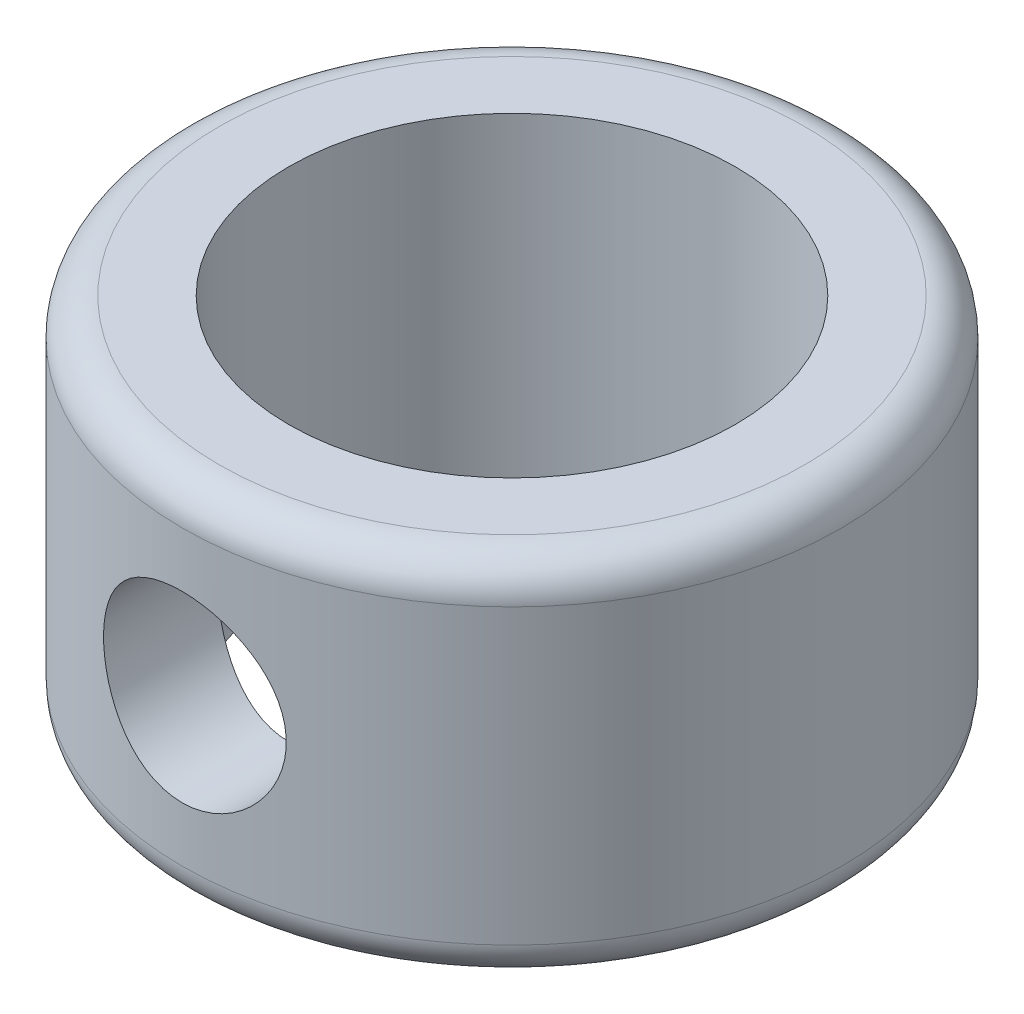
ISO-10303-21;
HEADER;
FILE_DESCRIPTION(('STEP AP214'),'2;1');
FILE_NAME('part.step','',(''),(''),'','','');
FILE_SCHEMA(('AUTOMOTIVE_DESIGN { 1 0 10303 214 1 1 1 1 }'));
ENDSEC;
DATA;
#1=APPLICATION_CONTEXT('core data for automotive mechanical design processes');
#2=APPLICATION_PROTOCOL_DEFINITION('international standard','automotive_design',2000,#1);
#3=PRODUCT_CONTEXT('',#1,'mechanical');
#4=PRODUCT('Part','Part','',(#3));
#5=PRODUCT_RELATED_PRODUCT_CATEGORY('part','',(#4));
#6=PRODUCT_DEFINITION_FORMATION('','',#4);
#7=PRODUCT_DEFINITION_CONTEXT('part definition',#1,'design');
#8=PRODUCT_DEFINITION('design','',#6,#7);
#9=PRODUCT_DEFINITION_SHAPE('','',#8);
#10=(LENGTH_UNIT() NAMED_UNIT(*) SI_UNIT(.MILLI.,.METRE.));
#11=(NAMED_UNIT(*) PLANE_ANGLE_UNIT() SI_UNIT($,.RADIAN.));
#12=(NAMED_UNIT(*) SI_UNIT($,.STERADIAN.) SOLID_ANGLE_UNIT());
#13=UNCERTAINTY_MEASURE_WITH_UNIT(LENGTH_MEASURE(1.E-05),#10,'distance_accuracy_value','');
#14=(GEOMETRIC_REPRESENTATION_CONTEXT(3) GLOBAL_UNCERTAINTY_ASSIGNED_CONTEXT((#13)) GLOBAL_UNIT_ASSIGNED_CONTEXT((#10,
#11,#12)) REPRESENTATION_CONTEXT('',''));
#15=CARTESIAN_POINT('',(0.,0.,0.));
#16=DIRECTION('',(0.,0.,1.));
#17=DIRECTION('',(1.,0.,0.));
#18=AXIS2_PLACEMENT_3D('',#15,#16,#17);
#19=CARTESIAN_POINT('',(0.,5.,0.));
#20=DIRECTION('',(0.,-1.,0.));
#21=DIRECTION('',(0.,0.,-1.));
#22=AXIS2_PLACEMENT_3D('',#19,#20,#21);
#23=CYLINDRICAL_SURFACE('',#22,4.5);
#24=CARTESIAN_POINT('',(0.,0.5,0.));
#25=DIRECTION('',(0.,1.,0.));
#26=DIRECTION('',(0.,0.,1.));
#27=AXIS2_PLACEMENT_3D('',#24,#25,#26);
#28=CIRCLE('',#27,4.5);
#29=CARTESIAN_POINT('',(0.,0.5,4.5));
#30=VERTEX_POINT('',#29);
#31=EDGE_CURVE('E45',#30,#30,#28,.T.);
#32=ORIENTED_EDGE('',*,*,#31,.T.);
#33=EDGE_LOOP('',(#32));
#34=FACE_BOUND('',#33,.T.);
#35=CARTESIAN_POINT('',(0.,4.5,0.));
#36=DIRECTION('',(0.,1.,0.));
#37=DIRECTION('',(0.,0.,1.));
#38=AXIS2_PLACEMENT_3D('',#35,#36,#37);
#39=CIRCLE('',#38,4.5);
#40=CARTESIAN_POINT('',(0.,4.5,4.5));
#41=VERTEX_POINT('',#40);
#42=EDGE_CURVE('E49',#41,#41,#39,.F.);
#43=ORIENTED_EDGE('',*,*,#42,.T.);
#44=EDGE_LOOP('',(#43));
#45=FACE_BOUND('',#44,.T.);
#46=CARTESIAN_POINT('',(0.,1.25002036742956,4.5));
#47=CARTESIAN_POINT('',(-0.0687867985193077,1.24962908340539,4.49999907835162));
#48=CARTESIAN_POINT('',(-0.137620681646486,1.25493193469285,4.49840740364831));
#49=CARTESIAN_POINT('',(-0.273363478537243,1.27674495379179,4.4922039229699));
#50=CARTESIAN_POINT('',(-0.340271575717872,1.29325980487634,4.48759085498165));
#51=CARTESIAN_POINT('',(-0.470182706848189,1.3369104939956,4.47584396965219));
#52=CARTESIAN_POINT('',(-0.533190863191631,1.36403204234445,4.46871354502711));
#53=CARTESIAN_POINT('',(-0.653761083188665,1.42806843134332,4.45267340309822));
#54=CARTESIAN_POINT('',(-0.711322657732572,1.46498415039163,4.44376352622049));
#55=CARTESIAN_POINT('',(-0.820805482224509,1.54853322226079,4.42486573902697));
#56=CARTESIAN_POINT('',(-0.872570854926272,1.5953663662246,4.4148580976246));
#57=CARTESIAN_POINT('',(-0.967624900953231,1.69700363330436,4.39500453366049));
#58=CARTESIAN_POINT('',(-1.01091234602417,1.75180890939515,4.38515863472049));
#59=CARTESIAN_POINT('',(-1.08859818040814,1.86914086806043,4.36653013557554));
#60=CARTESIAN_POINT('',(-1.12280796048446,1.93179665051689,4.35777185117617));
#61=CARTESIAN_POINT('',(-1.18014531755461,2.06225343690932,4.34259631371382));
#62=CARTESIAN_POINT('',(-1.20327510888978,2.13005340963617,4.33617859294927));
#63=CARTESIAN_POINT('',(-1.23723553631823,2.26714805037647,4.3266100935685));
#64=CARTESIAN_POINT('',(-1.24834958344264,2.33636713180389,4.32338419398391));
#65=CARTESIAN_POINT('',(-1.25885235075043,2.47575707450915,4.32033829650219));
#66=CARTESIAN_POINT('',(-1.25824354773085,2.54592773160789,4.32051757916001));
#67=CARTESIAN_POINT('',(-1.24553385619361,2.68290505674429,4.32419751120066));
#68=CARTESIAN_POINT('',(-1.23379246765751,2.74974834307287,4.32759425702248));
#69=CARTESIAN_POINT('',(-1.19973901545681,2.88047432617669,4.3371575877039));
#70=CARTESIAN_POINT('',(-1.17742607934798,2.94435677812364,4.34332440116831));
#71=CARTESIAN_POINT('',(-1.12261291302239,3.06819795538592,4.35781464118756));
#72=CARTESIAN_POINT('',(-1.08999956380315,3.12810371272757,4.36616182745472));
#73=CARTESIAN_POINT('',(-1.0155883454909,3.24171205091617,4.38406671560457));
#74=CARTESIAN_POINT('',(-0.973788519105874,3.29541330609178,4.39362467527333));
#75=CARTESIAN_POINT('',(-0.880408554083317,3.39712307008418,4.4133019002558));
#76=CARTESIAN_POINT('',(-0.828530302691036,3.44485676908894,4.42342898181173));
#77=CARTESIAN_POINT('',(-0.717390722758334,3.5310099777,4.44280630624069));
#78=CARTESIAN_POINT('',(-0.658128988504778,3.5694289751331,4.45205650088066));
#79=CARTESIAN_POINT('',(-0.533381866306301,3.63604317806341,4.46872272334313));
#80=CARTESIAN_POINT('',(-0.467860175832484,3.66417353112155,4.47612702592078));
#81=CARTESIAN_POINT('',(-0.332763217120183,3.70893635514701,4.48819125195288));
#82=CARTESIAN_POINT('',(-0.263188910739072,3.72557154244453,4.49285182371774));
#83=CARTESIAN_POINT('',(-0.124267746124466,3.74641906822345,4.49880442318295));
#84=CARTESIAN_POINT('',(-0.0549803351293656,3.7509995155806,4.5001961230763));
#85=CARTESIAN_POINT('',(0.083382074011731,3.74863625871982,4.4997590624576));
#86=CARTESIAN_POINT('',(0.152457096564681,3.74169393234098,4.49793068698543));
#87=CARTESIAN_POINT('',(0.287008968063931,3.71678611245671,4.49133353286731));
#88=CARTESIAN_POINT('',(0.352530032201255,3.69904227731882,4.48662387179653));
#89=CARTESIAN_POINT('',(0.479656418485948,3.65329892252477,4.47481941110882));
#90=CARTESIAN_POINT('',(0.541261317673154,3.6252982972987,4.46772435437908));
#91=CARTESIAN_POINT('',(0.660166857617373,3.55920996989491,4.45172472445217));
#92=CARTESIAN_POINT('',(0.71735769153401,3.52093294768485,4.44278700678431));
#93=CARTESIAN_POINT('',(0.82463354567207,3.43560650478259,4.42413258386829));
#94=CARTESIAN_POINT('',(0.874717040343792,3.38855520574228,4.41441571207753));
#95=CARTESIAN_POINT('',(0.967964107885223,3.28528221224737,4.39492754084472));
#96=CARTESIAN_POINT('',(1.01086495402419,3.22882140261351,4.38516389637364));
#97=CARTESIAN_POINT('',(1.08659855743341,3.1093025440408,4.36701565043549));
#98=CARTESIAN_POINT('',(1.11943160562284,3.04624468580095,4.35863100912397));
#99=CARTESIAN_POINT('',(1.17389115677597,2.91552936891266,4.34428061155656));
#100=CARTESIAN_POINT('',(1.19556746346289,2.84789390392364,4.33830413170084));
#101=CARTESIAN_POINT('',(1.22717637262954,2.70974108303954,4.32947022662521));
#102=CARTESIAN_POINT('',(1.23711226305489,2.63922453972692,4.32661192816466));
#103=CARTESIAN_POINT('',(1.24473935729844,2.49997329205795,4.32442342261644));
#104=CARTESIAN_POINT('',(1.24284881626762,2.43126311671963,4.32497269702351));
#105=CARTESIAN_POINT('',(1.2278681394314,2.29518083655786,4.32924926371648));
#106=CARTESIAN_POINT('',(1.21477839632322,2.22780868490171,4.33297644456987));
#107=CARTESIAN_POINT('',(1.17803526422238,2.09695656574252,4.34310809357223));
#108=CARTESIAN_POINT('',(1.15448728923489,2.03344477501691,4.34948580541169));
#109=CARTESIAN_POINT('',(1.09757830879849,1.91122748101352,4.36419312744464));
#110=CARTESIAN_POINT('',(1.06421567966895,1.85252277504838,4.37252306055612));
#111=CARTESIAN_POINT('',(0.987411180656536,1.73961759171712,4.39051456363658));
#112=CARTESIAN_POINT('',(0.943688947121821,1.6856131288158,4.40020940609471));
#113=CARTESIAN_POINT('',(0.847916655700465,1.58556985387657,4.41966300578545));
#114=CARTESIAN_POINT('',(0.795864530532489,1.53953302513521,4.42942177830587));
#115=CARTESIAN_POINT('',(0.683403674093089,1.45563725480219,4.44817740124969));
#116=CARTESIAN_POINT('',(0.622824309691489,1.41800120010594,4.45715033259884));
#117=CARTESIAN_POINT('',(0.495952725011888,1.35350126375061,4.47304216048424));
#118=CARTESIAN_POINT('',(0.429663858590424,1.32663110975153,4.47996225241686));
#119=CARTESIAN_POINT('',(0.303127065866537,1.28757704232177,4.49016109581678));
#120=CARTESIAN_POINT('',(0.243386651128978,1.27383398021878,4.49382106340418));
#121=CARTESIAN_POINT('',(0.122443147581194,1.25523034986168,4.49874078285427));
#122=CARTESIAN_POINT('',(0.061240233825373,1.25036872388236,4.50000082053481));
#123=CARTESIAN_POINT('',(0.,1.25002036742956,4.5));
#124=B_SPLINE_CURVE_WITH_KNOTS('',3,(#46,#47,#48,#49,#50,#51,#52,#53,#54,#55,#56,#57,#58,#59,
#60,#61,#62,#63,#64,#65,#66,#67,#68,#69,#70,#71,#72,#73,#74,#75,#76,#77,#78,#79,#80,#81,#82,#83,
#84,#85,#86,#87,#88,#89,#90,#91,#92,#93,#94,#95,#96,#97,#98,#99,#100,#101,#102,#103,#104,#105,
#106,#107,#108,#109,#110,#111,#112,#113,#114,#115,#116,#117,#118,#119,#120,#121,#122,#123),
.UNSPECIFIED.,.T.,.F.,(4,2,2,2,2,2,2,2,2,2,2,2,2,2,2,2,2,2,2,2,2,2,2,2,2,2,2,2,2,2,2,2,2,2,2,2,
2,2,4),(0.,0.206139121204505,0.412364400121111,0.618312797506904,0.824279671792413,
1.03487653083714,1.24550387792887,1.46021480243648,1.67488279893733,1.88436893904116,
2.0938108195196,2.29671167788631,2.49962928408743,2.7048577114755,2.91012990777037,
3.12279778847776,3.33547736017691,3.54947530874809,3.76342267187625,3.97075669022877,
4.17806591834052,4.381257983736,4.58447195746386,4.79172254594927,4.99901755251914,
5.21274033603257,5.4264569432284,5.63921105906272,5.85190557821312,6.05712148226377,
6.26233019076476,6.46551584713078,6.66873513629894,6.8782534287847,7.08782379960554,
7.30242588461178,7.51690275748173,7.7004483210906,7.88397202411012),.UNSPECIFIED.);
#125=CARTESIAN_POINT('',(0.,1.25002036742956,4.5));
#126=VERTEX_POINT('',#125);
#127=EDGE_CURVE('E54',#126,#126,#124,.T.);
#128=ORIENTED_EDGE('',*,*,#127,.T.);
#129=EDGE_LOOP('',(#128));
#130=FACE_BOUND('',#129,.T.);
#131=ADVANCED_FACE('F34',(#34,#45,#130),#23,.T.);
#132=CARTESIAN_POINT('',(0.,5.,0.));
#133=DIRECTION('',(0.,1.,0.));
#134=DIRECTION('',(0.,0.,1.));
#135=AXIS2_PLACEMENT_3D('',#132,#133,#134);
#136=PLANE('',#135);
#137=CARTESIAN_POINT('',(0.,5.,0.));
#138=DIRECTION('',(0.,1.,0.));
#139=DIRECTION('',(0.,0.,1.));
#140=AXIS2_PLACEMENT_3D('',#137,#138,#139);
#141=CIRCLE('',#140,4.);
#142=CARTESIAN_POINT('',(0.,5.,4.));
#143=VERTEX_POINT('',#142);
#144=EDGE_CURVE('E10',#143,#143,#141,.T.);
#145=ORIENTED_EDGE('',*,*,#144,.T.);
#146=EDGE_LOOP('',(#145));
#147=FACE_BOUND('',#146,.T.);
#148=CARTESIAN_POINT('',(0.,5.,0.));
#149=DIRECTION('',(0.,1.,0.));
#150=DIRECTION('',(0.,0.,1.));
#151=AXIS2_PLACEMENT_3D('',#148,#149,#150);
#152=CIRCLE('',#151,3.05);
#153=CARTESIAN_POINT('',(0.,5.,3.05));
#154=VERTEX_POINT('',#153);
#155=EDGE_CURVE('E82',#154,#154,#152,.T.);
#156=ORIENTED_EDGE('',*,*,#155,.F.);
#157=EDGE_LOOP('',(#156));
#158=FACE_BOUND('',#157,.T.);
#159=ADVANCED_FACE('F96',(#147,#158),#136,.T.);
#160=CARTESIAN_POINT('',(0.,0.,0.));
#161=DIRECTION('',(0.,1.,0.));
#162=DIRECTION('',(0.,0.,1.));
#163=AXIS2_PLACEMENT_3D('',#160,#161,#162);
#164=PLANE('',#163);
#165=CARTESIAN_POINT('',(0.,0.,0.));
#166=DIRECTION('',(0.,1.,0.));
#167=DIRECTION('',(0.,0.,1.));
#168=AXIS2_PLACEMENT_3D('',#165,#166,#167);
#169=CIRCLE('',#168,4.);
#170=CARTESIAN_POINT('',(0.,0.,4.));
#171=VERTEX_POINT('',#170);
#172=EDGE_CURVE('E41',#171,#171,#169,.F.);
#173=ORIENTED_EDGE('',*,*,#172,.T.);
#174=EDGE_LOOP('',(#173));
#175=FACE_BOUND('',#174,.T.);
#176=CARTESIAN_POINT('',(0.,0.,0.));
#177=DIRECTION('',(0.,1.,0.));
#178=DIRECTION('',(0.,0.,1.));
#179=AXIS2_PLACEMENT_3D('',#176,#177,#178);
#180=CIRCLE('',#179,3.05);
#181=CARTESIAN_POINT('',(0.,0.,3.05));
#182=VERTEX_POINT('',#181);
#183=EDGE_CURVE('E62',#182,#182,#180,.T.);
#184=ORIENTED_EDGE('',*,*,#183,.T.);
#185=EDGE_LOOP('',(#184));
#186=FACE_BOUND('',#185,.T.);
#187=ADVANCED_FACE('F89',(#175,#186),#164,.F.);
#188=CARTESIAN_POINT('',(0.,5.,0.));
#189=DIRECTION('',(0.,1.,0.));
#190=DIRECTION('',(0.,0.,1.));
#191=AXIS2_PLACEMENT_3D('',#188,#189,#190);
#192=CYLINDRICAL_SURFACE('',#191,3.05);
#193=CARTESIAN_POINT('',(0.,1.25002036742956,3.05));
#194=CARTESIAN_POINT('',(0.0670769721493477,1.25041010025507,3.04999491013113));
#195=CARTESIAN_POINT('',(0.134233415638585,1.25621826325433,3.04776143142519));
#196=CARTESIAN_POINT('',(0.266585171113359,1.27848248298864,3.03905584781216));
#197=CARTESIAN_POINT('',(0.331774774912775,1.29496689713114,3.03257245406189));
#198=CARTESIAN_POINT('',(0.458065048408787,1.33788181508863,3.01607641220413));
#199=CARTESIAN_POINT('',(0.519178631054849,1.36427896147729,3.00607560764593));
#200=CARTESIAN_POINT('',(0.636060061060386,1.42614049908713,2.98353402578099));
#201=CARTESIAN_POINT('',(0.69182962106131,1.46160197193953,2.97099406625526));
#202=CARTESIAN_POINT('',(0.799255158881872,1.54242422806007,2.9439592003857));
#203=CARTESIAN_POINT('',(0.850615602115044,1.58815682153028,2.929401943291));
#204=CARTESIAN_POINT('',(0.945187330370352,1.68742126316986,2.90027144657979));
#205=CARTESIAN_POINT('',(0.988394519352787,1.74095700768392,2.88569820260984));
#206=CARTESIAN_POINT('',(1.06739037263102,1.85730237406444,2.85745009411059));
#207=CARTESIAN_POINT('',(1.10274573873528,1.92042554894618,2.84384751381296));
#208=CARTESIAN_POINT('',(1.16220204415617,2.05236465834953,2.82007440789626));
#209=CARTESIAN_POINT('',(1.18630870447468,2.12117767805133,2.80990213838017));
#210=CARTESIAN_POINT('',(1.22139487465613,2.25910505631156,2.7948247897682));
#211=CARTESIAN_POINT('',(1.23294639032003,2.32804803329747,2.78969133658815));
#212=CARTESIAN_POINT('',(1.24437275605795,2.46707006563922,2.78461488413713));
#213=CARTESIAN_POINT('',(1.24425348579299,2.53714853115154,2.78466927126784));
#214=CARTESIAN_POINT('',(1.23279352224004,2.67107493034962,2.78975800005259));
#215=CARTESIAN_POINT('',(1.22226122980348,2.73500823047868,2.79443357400452));
#216=CARTESIAN_POINT('',(1.19160153671014,2.86010899142539,2.80764341171868));
#217=CARTESIAN_POINT('',(1.1714723337743,2.92127593036309,2.81617840025511));
#218=CARTESIAN_POINT('',(1.1217525815707,3.04073393601966,2.83635374439702));
#219=CARTESIAN_POINT('',(1.09195803496015,3.09892846798015,2.84806006574263));
#220=CARTESIAN_POINT('',(1.02389858511202,3.20971764685711,2.87322919118899));
#221=CARTESIAN_POINT('',(0.985630389530832,3.26231010535358,2.88669267717973));
#222=CARTESIAN_POINT('',(0.898090030748225,3.36485123925447,2.91516990374001));
#223=CARTESIAN_POINT('',(0.84818020701295,3.41424667088679,2.93022121487356));
#224=CARTESIAN_POINT('',(0.740606266504248,3.50413949442877,2.95924035140579));
#225=CARTESIAN_POINT('',(0.682940609294794,3.54463511447006,2.97320796069221));
#226=CARTESIAN_POINT('',(0.560017151797231,3.61623890392525,2.99881491093991));
#227=CARTESIAN_POINT('',(0.494635866268884,3.64715398800045,3.01040494505797));
#228=CARTESIAN_POINT('',(0.359004746658766,3.69735635718213,3.02957003150459));
#229=CARTESIAN_POINT('',(0.288757562334106,3.71664991621883,3.03714724990156));
#230=CARTESIAN_POINT('',(0.150096459366589,3.7419467819529,3.04704758653491));
#231=CARTESIAN_POINT('',(0.0818411278799048,3.74870342326728,3.04966871918241));
#232=CARTESIAN_POINT('',(-0.054866960224199,3.75095631464284,3.05027164089632));
#233=CARTESIAN_POINT('',(-0.123319660994059,3.74645548725879,3.04825463408243));
#234=CARTESIAN_POINT('',(-0.2551937512099,3.72686962648057,3.03999112988154));
#235=CARTESIAN_POINT('',(-0.318702082076101,3.71227793078707,3.03394222887373));
#236=CARTESIAN_POINT('',(-0.442302683123258,3.67359492211695,3.01840208953266));
#237=CARTESIAN_POINT('',(-0.502394491596296,3.64950232866642,3.00891038721317));
#238=CARTESIAN_POINT('',(-0.619683569519472,3.59165116387092,2.98700028176777));
#239=CARTESIAN_POINT('',(-0.676719780658615,3.55759973610966,2.97449560094503));
#240=CARTESIAN_POINT('',(-0.784473703099655,3.48112939356379,2.94791215327982));
#241=CARTESIAN_POINT('',(-0.835188747012935,3.43870696578164,2.93383272665334));
#242=CARTESIAN_POINT('',(-0.932552235203891,3.3432484620723,2.90441218068575));
#243=CARTESIAN_POINT('',(-0.978674373776932,3.28968019649481,2.88905130034701));
#244=CARTESIAN_POINT('',(-1.06140267024452,3.17528105257672,2.85969514199335));
#245=CARTESIAN_POINT('',(-1.09800710587583,3.11444886270449,2.84570011141976));
#246=CARTESIAN_POINT('',(-1.16089538834314,2.98629254535668,2.82063554299356));
#247=CARTESIAN_POINT('',(-1.18707275202098,2.91890976470165,2.80959654845095));
#248=CARTESIAN_POINT('',(-1.22748838041806,2.78009608482664,2.79217946650473));
#249=CARTESIAN_POINT('',(-1.24173625898667,2.70866849493922,2.78579762648194));
#250=CARTESIAN_POINT('',(-1.25699441697459,2.5697068226194,2.77894367185747));
#251=CARTESIAN_POINT('',(-1.25893723247077,2.50229496839988,2.77805536504024));
#252=CARTESIAN_POINT('',(-1.25197538639787,2.36815741149943,2.7811997847438));
#253=CARTESIAN_POINT('',(-1.24307209187212,2.30143162341562,2.78523189109598));
#254=CARTESIAN_POINT('',(-1.21542703263516,2.17344140712068,2.7974003786946));
#255=CARTESIAN_POINT('',(-1.19711568021246,2.11206532763371,2.80535664194371));
#256=CARTESIAN_POINT('',(-1.15157357897422,1.99323180328405,2.82435549661311));
#257=CARTESIAN_POINT('',(-1.12434030356385,1.93577547402879,2.83539896216654));
#258=CARTESIAN_POINT('',(-1.05980758089501,1.82259214251643,2.86016964614375));
#259=CARTESIAN_POINT('',(-1.02199497990025,1.7671850107113,2.87401957036176));
#260=CARTESIAN_POINT('',(-0.938132096414216,1.6632145119143,2.90247606657495));
#261=CARTESIAN_POINT('',(-0.892079080673655,1.61465342525984,2.91708288847876));
#262=CARTESIAN_POINT('',(-0.78923956611377,1.522291367282,2.94663435514237));
#263=CARTESIAN_POINT('',(-0.731929690299228,1.47905538119477,2.96153198352923));
#264=CARTESIAN_POINT('',(-0.610298934358171,1.40280166188375,2.98896566914351));
#265=CARTESIAN_POINT('',(-0.545974931397398,1.36978850539784,3.00150066764692));
#266=CARTESIAN_POINT('',(-0.413311620121533,1.31570332362608,3.02259850571217));
#267=CARTESIAN_POINT('',(-0.345070164096992,1.29441908924272,3.03123138993987));
#268=CARTESIAN_POINT('',(-0.205675301975727,1.26382012641555,3.04385541098905));
#269=CARTESIAN_POINT('',(-0.134531802810085,1.25446770285365,3.04786116209168));
#270=CARTESIAN_POINT('',(-0.0421420320970566,1.25031035034747,3.04978322166236));
#271=CARTESIAN_POINT('',(-0.0210749385785309,1.2498979171296,3.05000159918777));
#272=CARTESIAN_POINT('',(0.,1.25002036742956,3.05));
#273=B_SPLINE_CURVE_WITH_KNOTS('',3,(#193,#194,#195,#196,#197,#198,#199,#200,#201,#202,#203,
#204,#205,#206,#207,#208,#209,#210,#211,#212,#213,#214,#215,#216,#217,#218,#219,#220,#221,#222,
#223,#224,#225,#226,#227,#228,#229,#230,#231,#232,#233,#234,#235,#236,#237,#238,#239,#240,#241,
#242,#243,#244,#245,#246,#247,#248,#249,#250,#251,#252,#253,#254,#255,#256,#257,#258,#259,#260,
#261,#262,#263,#264,#265,#266,#267,#268,#269,#270,#271,#272),.UNSPECIFIED.,.T.,.F.,(4,2,2,2,2,2,
2,2,2,2,2,2,2,2,2,2,2,2,2,2,2,2,2,2,2,2,2,2,2,2,2,2,2,2,2,2,2,2,2,4),(0.,0.201175926564956,
0.402888404251095,0.60392809311803,0.804903136192862,1.01486672941262,1.22493552514378,
1.44467890778652,1.66431040856018,1.87345148077055,2.08248718970188,2.2764753017604,
2.47049985872613,2.66891962979038,2.86741663038591,3.08188561672938,3.29639726321789,
3.51498668955337,3.73345800343812,3.9383138222514,4.14311646390575,4.33855516298504,
4.5340202111247,4.73593841310788,4.93794153356553,5.1539604287387,5.37001838616167,
5.58822943201835,5.80626445411244,6.00755584933167,6.20882187641487,6.40160638459541,
6.59444553458299,6.79906080910487,7.00374407835694,7.22264563223704,7.44164504663464,
7.65653987779253,7.87075411575203,7.93396165419601),.UNSPECIFIED.);
#274=CARTESIAN_POINT('',(0.,1.25002036742956,3.05));
#275=VERTEX_POINT('',#274);
#276=EDGE_CURVE('E77',#275,#275,#273,.T.);
#277=ORIENTED_EDGE('',*,*,#276,.T.);
#278=EDGE_LOOP('',(#277));
#279=FACE_BOUND('',#278,.T.);
#280=ORIENTED_EDGE('',*,*,#183,.F.);
#281=EDGE_LOOP('',(#280));
#282=FACE_BOUND('',#281,.T.);
#283=ORIENTED_EDGE('',*,*,#155,.T.);
#284=EDGE_LOOP('',(#283));
#285=FACE_BOUND('',#284,.T.);
#286=ADVANCED_FACE('F71',(#279,#282,#285),#192,.F.);
#287=CARTESIAN_POINT('',(-0.00713569611392184,2.5,0.));
#288=DIRECTION('',(0.,0.,-1.));
#289=DIRECTION('',(-1.,0.,0.));
#290=AXIS2_PLACEMENT_3D('',#287,#288,#289);
#291=CYLINDRICAL_SURFACE('',#290,1.24999999999999);
#292=ORIENTED_EDGE('',*,*,#127,.F.);
#293=EDGE_LOOP('',(#292));
#294=FACE_BOUND('',#293,.T.);
#295=ORIENTED_EDGE('',*,*,#276,.F.);
#296=EDGE_LOOP('',(#295));
#297=FACE_BOUND('',#296,.T.);
#298=ADVANCED_FACE('F66',(#294,#297),#291,.F.);
#299=CARTESIAN_POINT('',(0.,0.5,0.));
#300=DIRECTION('',(0.,1.,0.));
#301=DIRECTION('',(0.,0.,1.));
#302=AXIS2_PLACEMENT_3D('',#299,#300,#301);
#303=TOROIDAL_SURFACE('',#302,4.,0.5);
#304=ORIENTED_EDGE('',*,*,#172,.F.);
#305=EDGE_LOOP('',(#304));
#306=FACE_BOUND('',#305,.T.);
#307=ORIENTED_EDGE('',*,*,#31,.F.);
#308=EDGE_LOOP('',(#307));
#309=FACE_BOUND('',#308,.T.);
#310=ADVANCED_FACE('F70',(#306,#309),#303,.T.);
#311=CARTESIAN_POINT('',(0.,4.5,0.));
#312=DIRECTION('',(0.,1.,0.));
#313=DIRECTION('',(0.,0.,1.));
#314=AXIS2_PLACEMENT_3D('',#311,#312,#313);
#315=TOROIDAL_SURFACE('',#314,4.,0.5);
#316=ORIENTED_EDGE('',*,*,#42,.F.);
#317=EDGE_LOOP('',(#316));
#318=FACE_BOUND('',#317,.T.);
#319=ORIENTED_EDGE('',*,*,#144,.F.);
#320=EDGE_LOOP('',(#319));
#321=FACE_BOUND('',#320,.T.);
#322=ADVANCED_FACE('F36',(#318,#321),#315,.T.);
#323=CLOSED_SHELL('',(#131,#159,#187,#286,#298,#310,#322));
#324=MANIFOLD_SOLID_BREP('B2',#323);
#325=ADVANCED_BREP_SHAPE_REPRESENTATION('',(#18,#324),#14);
#326=SHAPE_DEFINITION_REPRESENTATION(#9,#325);
ENDSEC;
END-ISO-10303-21;
